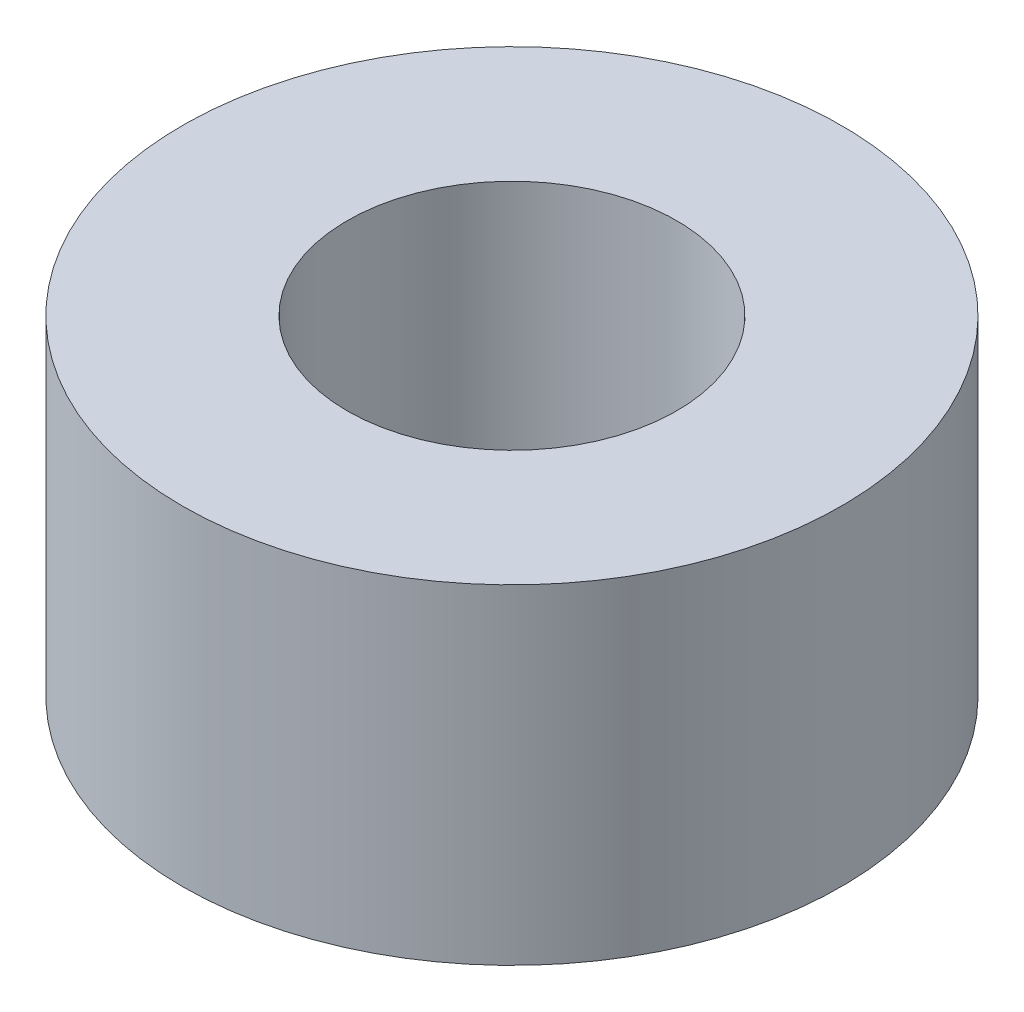
ISO-10303-21;
HEADER;
FILE_DESCRIPTION(('STEP AP214'),'2;1');
FILE_NAME('part.step','',(''),(''),'','','');
FILE_SCHEMA(('AUTOMOTIVE_DESIGN { 1 0 10303 214 1 1 1 1 }'));
ENDSEC;
DATA;
#1=APPLICATION_CONTEXT('core data for automotive mechanical design processes');
#2=APPLICATION_PROTOCOL_DEFINITION('international standard','automotive_design',2000,#1);
#3=PRODUCT_CONTEXT('',#1,'mechanical');
#4=PRODUCT('Part','Part','',(#3));
#5=PRODUCT_RELATED_PRODUCT_CATEGORY('part','',(#4));
#6=PRODUCT_DEFINITION_FORMATION('','',#4);
#7=PRODUCT_DEFINITION_CONTEXT('part definition',#1,'design');
#8=PRODUCT_DEFINITION('design','',#6,#7);
#9=PRODUCT_DEFINITION_SHAPE('','',#8);
#10=(LENGTH_UNIT() NAMED_UNIT(*) SI_UNIT(.MILLI.,.METRE.));
#11=(NAMED_UNIT(*) PLANE_ANGLE_UNIT() SI_UNIT($,.RADIAN.));
#12=(NAMED_UNIT(*) SI_UNIT($,.STERADIAN.) SOLID_ANGLE_UNIT());
#13=UNCERTAINTY_MEASURE_WITH_UNIT(LENGTH_MEASURE(1.E-05),#10,'distance_accuracy_value','');
#14=(GEOMETRIC_REPRESENTATION_CONTEXT(3) GLOBAL_UNCERTAINTY_ASSIGNED_CONTEXT((#13)) GLOBAL_UNIT_ASSIGNED_CONTEXT((#10,
#11,#12)) REPRESENTATION_CONTEXT('',''));
#15=CARTESIAN_POINT('',(0.,0.,0.));
#16=DIRECTION('',(0.,0.,1.));
#17=DIRECTION('',(1.,0.,0.));
#18=AXIS2_PLACEMENT_3D('',#15,#16,#17);
#19=CARTESIAN_POINT('',(0.,3.,0.));
#20=DIRECTION('',(0.,1.,0.));
#21=DIRECTION('',(0.,0.,1.));
#22=AXIS2_PLACEMENT_3D('',#19,#20,#21);
#23=PLANE('',#22);
#24=CARTESIAN_POINT('',(0.,3.,0.));
#25=DIRECTION('',(0.,1.,0.));
#26=DIRECTION('',(0.,0.,1.));
#27=AXIS2_PLACEMENT_3D('',#24,#25,#26);
#28=CIRCLE('',#27,3.);
#29=CARTESIAN_POINT('',(0.,3.,3.));
#30=VERTEX_POINT('',#29);
#31=EDGE_CURVE('E10',#30,#30,#28,.T.);
#32=ORIENTED_EDGE('',*,*,#31,.T.);
#33=EDGE_LOOP('',(#32));
#34=FACE_BOUND('',#33,.T.);
#35=CARTESIAN_POINT('',(0.,3.,0.));
#36=DIRECTION('',(0.,1.,0.));
#37=DIRECTION('',(0.,0.,1.));
#38=AXIS2_PLACEMENT_3D('',#35,#36,#37);
#39=CIRCLE('',#38,1.5);
#40=CARTESIAN_POINT('',(0.,3.,1.5));
#41=VERTEX_POINT('',#40);
#42=EDGE_CURVE('E52',#41,#41,#39,.T.);
#43=ORIENTED_EDGE('',*,*,#42,.F.);
#44=EDGE_LOOP('',(#43));
#45=FACE_BOUND('',#44,.T.);
#46=ADVANCED_FACE('F39',(#34,#45),#23,.T.);
#47=CARTESIAN_POINT('',(0.,0.,0.));
#48=DIRECTION('',(0.,1.,0.));
#49=DIRECTION('',(0.,0.,1.));
#50=AXIS2_PLACEMENT_3D('',#47,#48,#49);
#51=PLANE('',#50);
#52=CARTESIAN_POINT('',(0.,0.,0.));
#53=DIRECTION('',(0.,1.,0.));
#54=DIRECTION('',(0.,0.,1.));
#55=AXIS2_PLACEMENT_3D('',#52,#53,#54);
#56=CIRCLE('',#55,3.);
#57=CARTESIAN_POINT('',(0.,0.,3.));
#58=VERTEX_POINT('',#57);
#59=EDGE_CURVE('E43',#58,#58,#56,.T.);
#60=ORIENTED_EDGE('',*,*,#59,.F.);
#61=EDGE_LOOP('',(#60));
#62=FACE_BOUND('',#61,.T.);
#63=CARTESIAN_POINT('',(0.,0.,0.));
#64=DIRECTION('',(0.,1.,0.));
#65=DIRECTION('',(0.,0.,1.));
#66=AXIS2_PLACEMENT_3D('',#63,#64,#65);
#67=CIRCLE('',#66,1.5);
#68=CARTESIAN_POINT('',(0.,0.,1.5));
#69=VERTEX_POINT('',#68);
#70=EDGE_CURVE('E54',#69,#69,#67,.T.);
#71=ORIENTED_EDGE('',*,*,#70,.T.);
#72=EDGE_LOOP('',(#71));
#73=FACE_BOUND('',#72,.T.);
#74=ADVANCED_FACE('F66',(#62,#73),#51,.F.);
#75=CARTESIAN_POINT('',(0.,3.,0.));
#76=DIRECTION('',(0.,-1.,0.));
#77=DIRECTION('',(0.,0.,-1.));
#78=AXIS2_PLACEMENT_3D('',#75,#76,#77);
#79=CYLINDRICAL_SURFACE('',#78,3.);
#80=ORIENTED_EDGE('',*,*,#31,.F.);
#81=EDGE_LOOP('',(#80));
#82=FACE_BOUND('',#81,.T.);
#83=ORIENTED_EDGE('',*,*,#59,.T.);
#84=EDGE_LOOP('',(#83));
#85=FACE_BOUND('',#84,.T.);
#86=ADVANCED_FACE('F41',(#82,#85),#79,.T.);
#87=CARTESIAN_POINT('',(0.,3.,0.));
#88=DIRECTION('',(0.,-1.,0.));
#89=DIRECTION('',(0.,0.,-1.));
#90=AXIS2_PLACEMENT_3D('',#87,#88,#89);
#91=CYLINDRICAL_SURFACE('',#90,1.5);
#92=ORIENTED_EDGE('',*,*,#42,.T.);
#93=EDGE_LOOP('',(#92));
#94=FACE_BOUND('',#93,.T.);
#95=ORIENTED_EDGE('',*,*,#70,.F.);
#96=EDGE_LOOP('',(#95));
#97=FACE_BOUND('',#96,.T.);
#98=ADVANCED_FACE('F62',(#94,#97),#91,.F.);
#99=CLOSED_SHELL('',(#46,#74,#86,#98));
#100=MANIFOLD_SOLID_BREP('B2',#99);
#101=ADVANCED_BREP_SHAPE_REPRESENTATION('',(#18,#100),#14);
#102=SHAPE_DEFINITION_REPRESENTATION(#9,#101);
ENDSEC;
END-ISO-10303-21;
